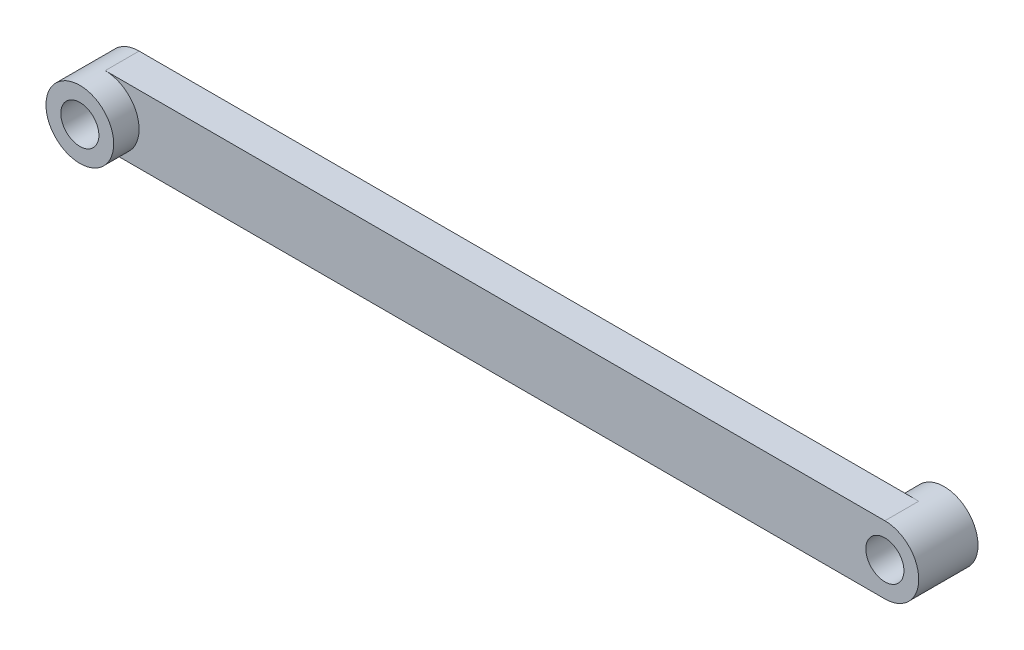
ISO-10303-21;
HEADER;
FILE_DESCRIPTION(('STEP AP214'),'2;1');
FILE_NAME('part.step','',(''),(''),'','','');
FILE_SCHEMA(('AUTOMOTIVE_DESIGN { 1 0 10303 214 1 1 1 1 }'));
ENDSEC;
DATA;
#1=APPLICATION_CONTEXT('core data for automotive mechanical design processes');
#2=APPLICATION_PROTOCOL_DEFINITION('international standard','automotive_design',2000,#1);
#3=PRODUCT_CONTEXT('',#1,'mechanical');
#4=PRODUCT('Part','Part','',(#3));
#5=PRODUCT_RELATED_PRODUCT_CATEGORY('part','',(#4));
#6=PRODUCT_DEFINITION_FORMATION('','',#4);
#7=PRODUCT_DEFINITION_CONTEXT('part definition',#1,'design');
#8=PRODUCT_DEFINITION('design','',#6,#7);
#9=PRODUCT_DEFINITION_SHAPE('','',#8);
#10=(LENGTH_UNIT() NAMED_UNIT(*) SI_UNIT(.MILLI.,.METRE.));
#11=(NAMED_UNIT(*) PLANE_ANGLE_UNIT() SI_UNIT($,.RADIAN.));
#12=(NAMED_UNIT(*) SI_UNIT($,.STERADIAN.) SOLID_ANGLE_UNIT());
#13=UNCERTAINTY_MEASURE_WITH_UNIT(LENGTH_MEASURE(1.E-05),#10,'distance_accuracy_value','');
#14=(GEOMETRIC_REPRESENTATION_CONTEXT(3) GLOBAL_UNCERTAINTY_ASSIGNED_CONTEXT((#13)) GLOBAL_UNIT_ASSIGNED_CONTEXT((#10,
#11,#12)) REPRESENTATION_CONTEXT('',''));
#15=CARTESIAN_POINT('',(0.,0.,0.));
#16=DIRECTION('',(0.,0.,1.));
#17=DIRECTION('',(1.,0.,0.));
#18=AXIS2_PLACEMENT_3D('',#15,#16,#17);
#19=CARTESIAN_POINT('',(0.,-4.,10.));
#20=DIRECTION('',(0.,1.,0.));
#21=DIRECTION('',(0.,0.,1.));
#22=AXIS2_PLACEMENT_3D('',#19,#20,#21);
#23=PLANE('',#22);
#24=DIRECTION('',(-1.,0.,0.));
#25=VECTOR('',#24,1.);
#26=CARTESIAN_POINT('',(0.,-4.,3.));
#27=LINE('',#26,#25);
#28=CARTESIAN_POINT('',(92.1,-4.00000000000001,3.));
#29=VERTEX_POINT('',#28);
#30=CARTESIAN_POINT('',(0.,-4.,3.));
#31=VERTEX_POINT('',#30);
#32=EDGE_CURVE('E62',#29,#31,#27,.T.);
#33=ORIENTED_EDGE('',*,*,#32,.F.);
#34=DIRECTION('',(0.,0.,-1.));
#35=VECTOR('',#34,1.);
#36=CARTESIAN_POINT('',(92.1,-4.,10.));
#37=LINE('',#36,#35);
#38=CARTESIAN_POINT('',(92.1,-4.,7.));
#39=VERTEX_POINT('',#38);
#40=EDGE_CURVE('E54',#39,#29,#37,.T.);
#41=ORIENTED_EDGE('',*,*,#40,.F.);
#42=DIRECTION('',(1.,0.,0.));
#43=VECTOR('',#42,1.);
#44=CARTESIAN_POINT('',(0.,-4.,7.));
#45=LINE('',#44,#43);
#46=CARTESIAN_POINT('',(0.,-4.,7.));
#47=VERTEX_POINT('',#46);
#48=EDGE_CURVE('E123',#47,#39,#45,.T.);
#49=ORIENTED_EDGE('',*,*,#48,.F.);
#50=DIRECTION('',(0.,0.,-1.));
#51=VECTOR('',#50,1.);
#52=CARTESIAN_POINT('',(0.,-4.,10.));
#53=LINE('',#52,#51);
#54=EDGE_CURVE('E12',#47,#31,#53,.T.);
#55=ORIENTED_EDGE('',*,*,#54,.T.);
#56=EDGE_LOOP('',(#33,#41,#49,#55));
#57=FACE_BOUND('',#56,.T.);
#58=ADVANCED_FACE('F45',(#57),#23,.F.);
#59=CARTESIAN_POINT('',(0.,4.,10.));
#60=DIRECTION('',(0.,-1.,0.));
#61=DIRECTION('',(0.,0.,-1.));
#62=AXIS2_PLACEMENT_3D('',#59,#60,#61);
#63=PLANE('',#62);
#64=DIRECTION('',(1.,0.,0.));
#65=VECTOR('',#64,1.);
#66=CARTESIAN_POINT('',(0.,4.,3.));
#67=LINE('',#66,#65);
#68=CARTESIAN_POINT('',(0.,4.,3.));
#69=VERTEX_POINT('',#68);
#70=CARTESIAN_POINT('',(92.1,4.00000000000001,3.));
#71=VERTEX_POINT('',#70);
#72=EDGE_CURVE('E87',#69,#71,#67,.T.);
#73=ORIENTED_EDGE('',*,*,#72,.F.);
#74=DIRECTION('',(0.,0.,-1.));
#75=VECTOR('',#74,1.);
#76=CARTESIAN_POINT('',(0.,4.,10.));
#77=LINE('',#76,#75);
#78=CARTESIAN_POINT('',(0.,4.,7.));
#79=VERTEX_POINT('',#78);
#80=EDGE_CURVE('E107',#79,#69,#77,.T.);
#81=ORIENTED_EDGE('',*,*,#80,.F.);
#82=DIRECTION('',(-1.,0.,0.));
#83=VECTOR('',#82,1.);
#84=CARTESIAN_POINT('',(0.,4.,7.));
#85=LINE('',#84,#83);
#86=CARTESIAN_POINT('',(92.1,4.,7.));
#87=VERTEX_POINT('',#86);
#88=EDGE_CURVE('E106',#87,#79,#85,.T.);
#89=ORIENTED_EDGE('',*,*,#88,.F.);
#90=DIRECTION('',(0.,0.,-1.));
#91=VECTOR('',#90,1.);
#92=CARTESIAN_POINT('',(92.1,4.,10.));
#93=LINE('',#92,#91);
#94=EDGE_CURVE('E101',#87,#71,#93,.T.);
#95=ORIENTED_EDGE('',*,*,#94,.T.);
#96=EDGE_LOOP('',(#73,#81,#89,#95));
#97=FACE_BOUND('',#96,.T.);
#98=ADVANCED_FACE('F105',(#97),#63,.F.);
#99=CARTESIAN_POINT('',(0.,0.,0.));
#100=DIRECTION('',(0.,0.,1.));
#101=DIRECTION('',(1.,0.,0.));
#102=AXIS2_PLACEMENT_3D('',#99,#100,#101);
#103=PLANE('',#102);
#104=CARTESIAN_POINT('',(92.1,0.,0.));
#105=DIRECTION('',(0.,0.,1.));
#106=DIRECTION('',(1.,0.,0.));
#107=AXIS2_PLACEMENT_3D('',#104,#105,#106);
#108=CIRCLE('',#107,2.25);
#109=CARTESIAN_POINT('',(94.35,0.,0.));
#110=VERTEX_POINT('',#109);
#111=EDGE_CURVE('E125',#110,#110,#108,.T.);
#112=ORIENTED_EDGE('',*,*,#111,.T.);
#113=EDGE_LOOP('',(#112));
#114=FACE_BOUND('',#113,.T.);
#115=CARTESIAN_POINT('',(92.1,0.,0.));
#116=DIRECTION('',(0.,0.,1.));
#117=DIRECTION('',(1.,0.,0.));
#118=AXIS2_PLACEMENT_3D('',#115,#116,#117);
#119=CIRCLE('',#118,4.);
#120=CARTESIAN_POINT('',(96.1,0.,0.));
#121=VERTEX_POINT('',#120);
#122=EDGE_CURVE('E131',#121,#121,#119,.T.);
#123=ORIENTED_EDGE('',*,*,#122,.F.);
#124=EDGE_LOOP('',(#123));
#125=FACE_BOUND('',#124,.T.);
#126=ADVANCED_FACE('F137',(#114,#125),#103,.F.);
#127=CARTESIAN_POINT('',(0.,0.,10.));
#128=DIRECTION('',(0.,0.,-1.));
#129=DIRECTION('',(-1.,0.,0.));
#130=AXIS2_PLACEMENT_3D('',#127,#128,#129);
#131=CYLINDRICAL_SURFACE('',#130,4.);
#132=CARTESIAN_POINT('',(0.,0.,10.));
#133=DIRECTION('',(0.,0.,1.));
#134=DIRECTION('',(1.,0.,0.));
#135=AXIS2_PLACEMENT_3D('',#132,#133,#134);
#136=CIRCLE('',#135,4.);
#137=CARTESIAN_POINT('',(4.,0.,10.));
#138=VERTEX_POINT('',#137);
#139=EDGE_CURVE('E110',#138,#138,#136,.T.);
#140=ORIENTED_EDGE('',*,*,#139,.F.);
#141=EDGE_LOOP('',(#140));
#142=FACE_BOUND('',#141,.T.);
#143=CARTESIAN_POINT('',(0.,0.,3.));
#144=DIRECTION('',(0.,0.,-1.));
#145=DIRECTION('',(-1.,0.,0.));
#146=AXIS2_PLACEMENT_3D('',#143,#144,#145);
#147=CIRCLE('',#146,4.);
#148=EDGE_CURVE('E91',#31,#69,#147,.T.);
#149=ORIENTED_EDGE('',*,*,#148,.F.);
#150=ORIENTED_EDGE('',*,*,#54,.F.);
#151=CARTESIAN_POINT('',(0.,0.,7.));
#152=DIRECTION('',(0.,0.,1.));
#153=DIRECTION('',(1.,0.,0.));
#154=AXIS2_PLACEMENT_3D('',#151,#152,#153);
#155=CIRCLE('',#154,4.);
#156=EDGE_CURVE('E70',#47,#79,#155,.T.);
#157=ORIENTED_EDGE('',*,*,#156,.T.);
#158=ORIENTED_EDGE('',*,*,#80,.T.);
#159=EDGE_LOOP('',(#149,#150,#157,#158));
#160=FACE_BOUND('',#159,.T.);
#161=ADVANCED_FACE('F47',(#142,#160),#131,.T.);
#162=CARTESIAN_POINT('',(0.,0.,10.));
#163=DIRECTION('',(0.,0.,-1.));
#164=DIRECTION('',(-1.,0.,0.));
#165=AXIS2_PLACEMENT_3D('',#162,#163,#164);
#166=CYLINDRICAL_SURFACE('',#165,2.25);
#167=CARTESIAN_POINT('',(0.,0.,10.));
#168=DIRECTION('',(0.,0.,1.));
#169=DIRECTION('',(1.,0.,0.));
#170=AXIS2_PLACEMENT_3D('',#167,#168,#169);
#171=CIRCLE('',#170,2.25);
#172=CARTESIAN_POINT('',(2.25,0.,10.));
#173=VERTEX_POINT('',#172);
#174=EDGE_CURVE('E128',#173,#173,#171,.T.);
#175=ORIENTED_EDGE('',*,*,#174,.T.);
#176=EDGE_LOOP('',(#175));
#177=FACE_BOUND('',#176,.T.);
#178=CARTESIAN_POINT('',(0.,0.,3.));
#179=DIRECTION('',(0.,0.,-1.));
#180=DIRECTION('',(-1.,0.,0.));
#181=AXIS2_PLACEMENT_3D('',#178,#179,#180);
#182=CIRCLE('',#181,2.25);
#183=CARTESIAN_POINT('',(-2.25,0.,3.));
#184=VERTEX_POINT('',#183);
#185=EDGE_CURVE('E49',#184,#184,#182,.T.);
#186=ORIENTED_EDGE('',*,*,#185,.T.);
#187=EDGE_LOOP('',(#186));
#188=FACE_BOUND('',#187,.T.);
#189=ADVANCED_FACE('F145',(#177,#188),#166,.F.);
#190=CARTESIAN_POINT('',(0.,0.,10.));
#191=DIRECTION('',(0.,0.,1.));
#192=DIRECTION('',(1.,0.,0.));
#193=AXIS2_PLACEMENT_3D('',#190,#191,#192);
#194=PLANE('',#193);
#195=ORIENTED_EDGE('',*,*,#174,.F.);
#196=EDGE_LOOP('',(#195));
#197=FACE_BOUND('',#196,.T.);
#198=ORIENTED_EDGE('',*,*,#139,.T.);
#199=EDGE_LOOP('',(#198));
#200=FACE_BOUND('',#199,.T.);
#201=ADVANCED_FACE('F156',(#197,#200),#194,.T.);
#202=CARTESIAN_POINT('',(92.1,0.,10.));
#203=DIRECTION('',(0.,0.,-1.));
#204=DIRECTION('',(-1.,0.,0.));
#205=AXIS2_PLACEMENT_3D('',#202,#203,#204);
#206=CYLINDRICAL_SURFACE('',#205,4.);
#207=ORIENTED_EDGE('',*,*,#122,.T.);
#208=EDGE_LOOP('',(#207));
#209=FACE_BOUND('',#208,.T.);
#210=ORIENTED_EDGE('',*,*,#40,.T.);
#211=CARTESIAN_POINT('',(92.1,0.,3.));
#212=DIRECTION('',(0.,0.,-1.));
#213=DIRECTION('',(-1.,0.,0.));
#214=AXIS2_PLACEMENT_3D('',#211,#212,#213);
#215=CIRCLE('',#214,4.00000000000001);
#216=EDGE_CURVE('E90',#29,#71,#215,.T.);
#217=ORIENTED_EDGE('',*,*,#216,.T.);
#218=ORIENTED_EDGE('',*,*,#94,.F.);
#219=CARTESIAN_POINT('',(92.1,0.,7.));
#220=DIRECTION('',(0.,0.,1.));
#221=DIRECTION('',(1.,0.,0.));
#222=AXIS2_PLACEMENT_3D('',#219,#220,#221);
#223=CIRCLE('',#222,4.);
#224=EDGE_CURVE('E117',#39,#87,#223,.T.);
#225=ORIENTED_EDGE('',*,*,#224,.F.);
#226=EDGE_LOOP('',(#210,#217,#218,#225));
#227=FACE_BOUND('',#226,.T.);
#228=ADVANCED_FACE('F99',(#209,#227),#206,.T.);
#229=CARTESIAN_POINT('',(92.1,0.,10.));
#230=DIRECTION('',(0.,0.,-1.));
#231=DIRECTION('',(-1.,0.,0.));
#232=AXIS2_PLACEMENT_3D('',#229,#230,#231);
#233=CYLINDRICAL_SURFACE('',#232,2.25);
#234=ORIENTED_EDGE('',*,*,#111,.F.);
#235=EDGE_LOOP('',(#234));
#236=FACE_BOUND('',#235,.T.);
#237=CARTESIAN_POINT('',(92.1,0.,7.));
#238=DIRECTION('',(0.,0.,1.));
#239=DIRECTION('',(1.,0.,0.));
#240=AXIS2_PLACEMENT_3D('',#237,#238,#239);
#241=CIRCLE('',#240,2.25);
#242=CARTESIAN_POINT('',(94.35,0.,7.));
#243=VERTEX_POINT('',#242);
#244=EDGE_CURVE('E113',#243,#243,#241,.T.);
#245=ORIENTED_EDGE('',*,*,#244,.T.);
#246=EDGE_LOOP('',(#245));
#247=FACE_BOUND('',#246,.T.);
#248=ADVANCED_FACE('F155',(#236,#247),#233,.F.);
#249=CARTESIAN_POINT('',(0.,0.,7.));
#250=DIRECTION('',(0.,0.,1.));
#251=DIRECTION('',(1.,0.,0.));
#252=AXIS2_PLACEMENT_3D('',#249,#250,#251);
#253=PLANE('',#252);
#254=ORIENTED_EDGE('',*,*,#244,.F.);
#255=EDGE_LOOP('',(#254));
#256=FACE_BOUND('',#255,.T.);
#257=ORIENTED_EDGE('',*,*,#48,.T.);
#258=ORIENTED_EDGE('',*,*,#224,.T.);
#259=ORIENTED_EDGE('',*,*,#88,.T.);
#260=ORIENTED_EDGE('',*,*,#156,.F.);
#261=EDGE_LOOP('',(#257,#258,#259,#260));
#262=FACE_BOUND('',#261,.T.);
#263=ADVANCED_FACE('F161',(#256,#262),#253,.T.);
#264=CARTESIAN_POINT('',(92.1,0.,3.));
#265=DIRECTION('',(0.,0.,-1.));
#266=DIRECTION('',(-1.,0.,0.));
#267=AXIS2_PLACEMENT_3D('',#264,#265,#266);
#268=PLANE('',#267);
#269=ORIENTED_EDGE('',*,*,#185,.F.);
#270=EDGE_LOOP('',(#269));
#271=FACE_BOUND('',#270,.T.);
#272=ORIENTED_EDGE('',*,*,#32,.T.);
#273=ORIENTED_EDGE('',*,*,#148,.T.);
#274=ORIENTED_EDGE('',*,*,#72,.T.);
#275=ORIENTED_EDGE('',*,*,#216,.F.);
#276=EDGE_LOOP('',(#272,#273,#274,#275));
#277=FACE_BOUND('',#276,.T.);
#278=ADVANCED_FACE('F89',(#271,#277),#268,.T.);
#279=CLOSED_SHELL('',(#58,#98,#126,#161,#189,#201,#228,#248,#263,#278));
#280=MANIFOLD_SOLID_BREP('B2',#279);
#281=ADVANCED_BREP_SHAPE_REPRESENTATION('',(#18,#280),#14);
#282=SHAPE_DEFINITION_REPRESENTATION(#9,#281);
ENDSEC;
END-ISO-10303-21;
